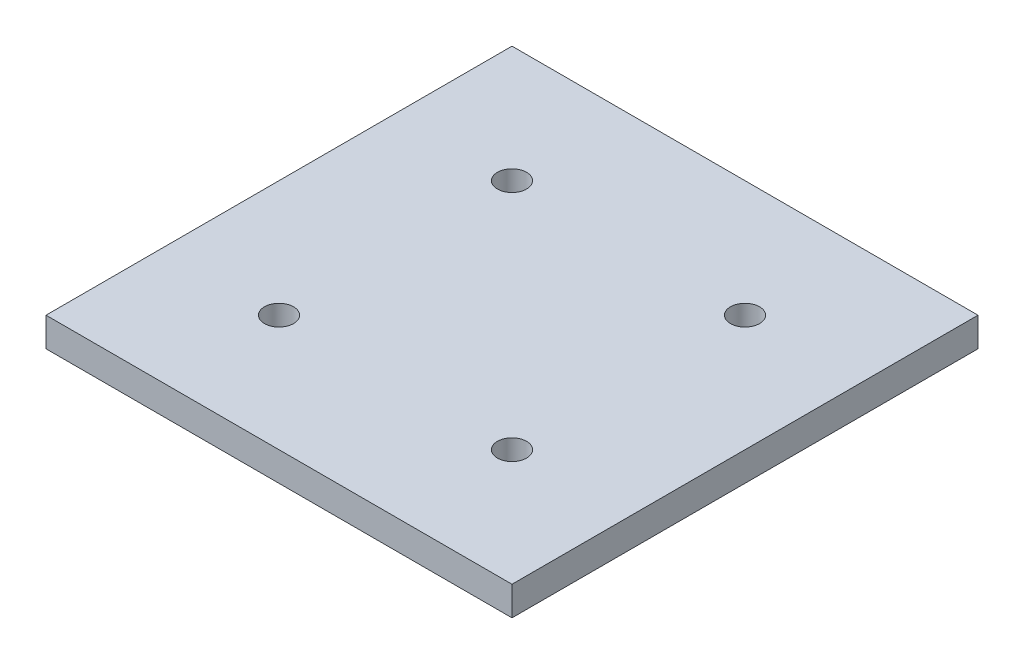
ISO-10303-21;
HEADER;
FILE_DESCRIPTION(('STEP AP214'),'2;1');
FILE_NAME('part.step','',(''),(''),'','','');
FILE_SCHEMA(('AUTOMOTIVE_DESIGN { 1 0 10303 214 1 1 1 1 }'));
ENDSEC;
DATA;
#1=APPLICATION_CONTEXT('core data for automotive mechanical design processes');
#2=APPLICATION_PROTOCOL_DEFINITION('international standard','automotive_design',2000,#1);
#3=PRODUCT_CONTEXT('',#1,'mechanical');
#4=PRODUCT('Part','Part','',(#3));
#5=PRODUCT_RELATED_PRODUCT_CATEGORY('part','',(#4));
#6=PRODUCT_DEFINITION_FORMATION('','',#4);
#7=PRODUCT_DEFINITION_CONTEXT('part definition',#1,'design');
#8=PRODUCT_DEFINITION('design','',#6,#7);
#9=PRODUCT_DEFINITION_SHAPE('','',#8);
#10=(LENGTH_UNIT() NAMED_UNIT(*) SI_UNIT(.MILLI.,.METRE.));
#11=(NAMED_UNIT(*) PLANE_ANGLE_UNIT() SI_UNIT($,.RADIAN.));
#12=(NAMED_UNIT(*) SI_UNIT($,.STERADIAN.) SOLID_ANGLE_UNIT());
#13=UNCERTAINTY_MEASURE_WITH_UNIT(LENGTH_MEASURE(1.E-05),#10,'distance_accuracy_value','');
#14=(GEOMETRIC_REPRESENTATION_CONTEXT(3) GLOBAL_UNCERTAINTY_ASSIGNED_CONTEXT((#13)) GLOBAL_UNIT_ASSIGNED_CONTEXT((#10,
#11,#12)) REPRESENTATION_CONTEXT('',''));
#15=CARTESIAN_POINT('',(0.,0.,0.));
#16=DIRECTION('',(0.,0.,1.));
#17=DIRECTION('',(1.,0.,0.));
#18=AXIS2_PLACEMENT_3D('',#15,#16,#17);
#19=CARTESIAN_POINT('',(0.,6.35,0.));
#20=DIRECTION('',(0.,1.,0.));
#21=DIRECTION('',(0.,0.,1.));
#22=AXIS2_PLACEMENT_3D('',#19,#20,#21);
#23=PLANE('',#22);
#24=CARTESIAN_POINT('',(25.4,6.35,25.4));
#25=DIRECTION('',(0.,1.,0.));
#26=DIRECTION('',(0.,0.,1.));
#27=AXIS2_PLACEMENT_3D('',#24,#25,#26);
#28=CIRCLE('',#27,3.175);
#29=CARTESIAN_POINT('',(25.4,6.35,28.575));
#30=VERTEX_POINT('',#29);
#31=EDGE_CURVE('E121',#30,#30,#28,.T.);
#32=ORIENTED_EDGE('',*,*,#31,.F.);
#33=EDGE_LOOP('',(#32));
#34=FACE_BOUND('',#33,.T.);
#35=CARTESIAN_POINT('',(-25.4,6.35,-25.4));
#36=DIRECTION('',(0.,1.,0.));
#37=DIRECTION('',(0.,0.,1.));
#38=AXIS2_PLACEMENT_3D('',#35,#36,#37);
#39=CIRCLE('',#38,3.175);
#40=CARTESIAN_POINT('',(-25.4,6.35,-22.225));
#41=VERTEX_POINT('',#40);
#42=EDGE_CURVE('E100',#41,#41,#39,.T.);
#43=ORIENTED_EDGE('',*,*,#42,.F.);
#44=EDGE_LOOP('',(#43));
#45=FACE_BOUND('',#44,.T.);
#46=DIRECTION('',(0.,0.,1.));
#47=VECTOR('',#46,1.);
#48=CARTESIAN_POINT('',(-50.8,6.35,-50.8));
#49=LINE('',#48,#47);
#50=CARTESIAN_POINT('',(-50.8,6.35,-50.8));
#51=VERTEX_POINT('',#50);
#52=CARTESIAN_POINT('',(-50.8,6.35,50.8));
#53=VERTEX_POINT('',#52);
#54=EDGE_CURVE('E85',#51,#53,#49,.T.);
#55=ORIENTED_EDGE('',*,*,#54,.T.);
#56=DIRECTION('',(1.,0.,0.));
#57=VECTOR('',#56,1.);
#58=CARTESIAN_POINT('',(-50.8,6.35,50.8));
#59=LINE('',#58,#57);
#60=CARTESIAN_POINT('',(50.8,6.35,50.8));
#61=VERTEX_POINT('',#60);
#62=EDGE_CURVE('E80',#53,#61,#59,.T.);
#63=ORIENTED_EDGE('',*,*,#62,.T.);
#64=DIRECTION('',(0.,0.,-1.));
#65=VECTOR('',#64,1.);
#66=CARTESIAN_POINT('',(50.8,6.35,-50.8));
#67=LINE('',#66,#65);
#68=CARTESIAN_POINT('',(50.8,6.35,-50.8));
#69=VERTEX_POINT('',#68);
#70=EDGE_CURVE('E83',#61,#69,#67,.T.);
#71=ORIENTED_EDGE('',*,*,#70,.T.);
#72=DIRECTION('',(-1.,0.,0.));
#73=VECTOR('',#72,1.);
#74=CARTESIAN_POINT('',(-50.8,6.35,-50.8));
#75=LINE('',#74,#73);
#76=EDGE_CURVE('E50',#69,#51,#75,.T.);
#77=ORIENTED_EDGE('',*,*,#76,.T.);
#78=EDGE_LOOP('',(#55,#63,#71,#77));
#79=FACE_BOUND('',#78,.T.);
#80=CARTESIAN_POINT('',(25.4,6.35,-25.4));
#81=DIRECTION('',(0.,1.,0.));
#82=DIRECTION('',(0.,0.,-1.));
#83=AXIS2_PLACEMENT_3D('',#80,#81,#82);
#84=CIRCLE('',#83,3.175);
#85=CARTESIAN_POINT('',(25.4,6.35,-28.575));
#86=VERTEX_POINT('',#85);
#87=EDGE_CURVE('E115',#86,#86,#84,.T.);
#88=ORIENTED_EDGE('',*,*,#87,.F.);
#89=EDGE_LOOP('',(#88));
#90=FACE_BOUND('',#89,.T.);
#91=CARTESIAN_POINT('',(-25.4,6.35,25.4));
#92=DIRECTION('',(0.,1.,0.));
#93=DIRECTION('',(0.,0.,-1.));
#94=AXIS2_PLACEMENT_3D('',#91,#92,#93);
#95=CIRCLE('',#94,3.175);
#96=CARTESIAN_POINT('',(-25.4,6.35,22.225));
#97=VERTEX_POINT('',#96);
#98=EDGE_CURVE('E127',#97,#97,#95,.T.);
#99=ORIENTED_EDGE('',*,*,#98,.F.);
#100=EDGE_LOOP('',(#99));
#101=FACE_BOUND('',#100,.T.);
#102=ADVANCED_FACE('F33',(#34,#45,#79,#90,#101),#23,.T.);
#103=CARTESIAN_POINT('',(0.,0.,0.));
#104=DIRECTION('',(0.,1.,0.));
#105=DIRECTION('',(0.,0.,1.));
#106=AXIS2_PLACEMENT_3D('',#103,#104,#105);
#107=PLANE('',#106);
#108=DIRECTION('',(0.,0.,1.));
#109=VECTOR('',#108,1.);
#110=CARTESIAN_POINT('',(-50.8,0.,-50.8));
#111=LINE('',#110,#109);
#112=CARTESIAN_POINT('',(-50.8,0.,-50.8));
#113=VERTEX_POINT('',#112);
#114=CARTESIAN_POINT('',(-50.8,0.,50.8));
#115=VERTEX_POINT('',#114);
#116=EDGE_CURVE('E97',#113,#115,#111,.T.);
#117=ORIENTED_EDGE('',*,*,#116,.F.);
#118=DIRECTION('',(-1.,0.,0.));
#119=VECTOR('',#118,1.);
#120=CARTESIAN_POINT('',(-50.8,0.,-50.8));
#121=LINE('',#120,#119);
#122=CARTESIAN_POINT('',(50.8,0.,-50.8));
#123=VERTEX_POINT('',#122);
#124=EDGE_CURVE('E73',#123,#113,#121,.T.);
#125=ORIENTED_EDGE('',*,*,#124,.F.);
#126=DIRECTION('',(0.,0.,-1.));
#127=VECTOR('',#126,1.);
#128=CARTESIAN_POINT('',(50.8,0.,-50.8));
#129=LINE('',#128,#127);
#130=CARTESIAN_POINT('',(50.8,0.,50.8));
#131=VERTEX_POINT('',#130);
#132=EDGE_CURVE('E67',#131,#123,#129,.T.);
#133=ORIENTED_EDGE('',*,*,#132,.F.);
#134=DIRECTION('',(1.,0.,0.));
#135=VECTOR('',#134,1.);
#136=CARTESIAN_POINT('',(-50.8,0.,50.8));
#137=LINE('',#136,#135);
#138=EDGE_CURVE('E89',#115,#131,#137,.T.);
#139=ORIENTED_EDGE('',*,*,#138,.F.);
#140=EDGE_LOOP('',(#117,#125,#133,#139));
#141=FACE_BOUND('',#140,.T.);
#142=CARTESIAN_POINT('',(-25.4,0.,-25.4));
#143=DIRECTION('',(0.,1.,0.));
#144=DIRECTION('',(0.,0.,1.));
#145=AXIS2_PLACEMENT_3D('',#142,#143,#144);
#146=CIRCLE('',#145,3.175);
#147=CARTESIAN_POINT('',(-25.4,0.,-22.225));
#148=VERTEX_POINT('',#147);
#149=EDGE_CURVE('E112',#148,#148,#146,.T.);
#150=ORIENTED_EDGE('',*,*,#149,.T.);
#151=EDGE_LOOP('',(#150));
#152=FACE_BOUND('',#151,.T.);
#153=CARTESIAN_POINT('',(25.4,0.,-25.4));
#154=DIRECTION('',(0.,1.,0.));
#155=DIRECTION('',(0.,0.,-1.));
#156=AXIS2_PLACEMENT_3D('',#153,#154,#155);
#157=CIRCLE('',#156,3.175);
#158=CARTESIAN_POINT('',(25.4,0.,-28.575));
#159=VERTEX_POINT('',#158);
#160=EDGE_CURVE('E118',#159,#159,#157,.T.);
#161=ORIENTED_EDGE('',*,*,#160,.T.);
#162=EDGE_LOOP('',(#161));
#163=FACE_BOUND('',#162,.T.);
#164=CARTESIAN_POINT('',(25.4,0.,25.4));
#165=DIRECTION('',(0.,1.,0.));
#166=DIRECTION('',(0.,0.,1.));
#167=AXIS2_PLACEMENT_3D('',#164,#165,#166);
#168=CIRCLE('',#167,3.175);
#169=CARTESIAN_POINT('',(25.4,0.,28.575));
#170=VERTEX_POINT('',#169);
#171=EDGE_CURVE('E124',#170,#170,#168,.T.);
#172=ORIENTED_EDGE('',*,*,#171,.T.);
#173=EDGE_LOOP('',(#172));
#174=FACE_BOUND('',#173,.T.);
#175=CARTESIAN_POINT('',(-25.4,0.,25.4));
#176=DIRECTION('',(0.,1.,0.));
#177=DIRECTION('',(0.,0.,-1.));
#178=AXIS2_PLACEMENT_3D('',#175,#176,#177);
#179=CIRCLE('',#178,3.175);
#180=CARTESIAN_POINT('',(-25.4,0.,22.225));
#181=VERTEX_POINT('',#180);
#182=EDGE_CURVE('E130',#181,#181,#179,.T.);
#183=ORIENTED_EDGE('',*,*,#182,.T.);
#184=EDGE_LOOP('',(#183));
#185=FACE_BOUND('',#184,.T.);
#186=ADVANCED_FACE('F108',(#141,#152,#163,#174,#185),#107,.F.);
#187=CARTESIAN_POINT('',(-50.8,6.35,-50.8));
#188=DIRECTION('',(1.,0.,0.));
#189=DIRECTION('',(0.,0.,-1.));
#190=AXIS2_PLACEMENT_3D('',#187,#188,#189);
#191=PLANE('',#190);
#192=ORIENTED_EDGE('',*,*,#116,.T.);
#193=DIRECTION('',(0.,-1.,0.));
#194=VECTOR('',#193,1.);
#195=CARTESIAN_POINT('',(-50.8,6.35,50.8));
#196=LINE('',#195,#194);
#197=EDGE_CURVE('E11',#53,#115,#196,.T.);
#198=ORIENTED_EDGE('',*,*,#197,.F.);
#199=ORIENTED_EDGE('',*,*,#54,.F.);
#200=DIRECTION('',(0.,-1.,0.));
#201=VECTOR('',#200,1.);
#202=CARTESIAN_POINT('',(-50.8,6.35,-50.8));
#203=LINE('',#202,#201);
#204=EDGE_CURVE('E93',#51,#113,#203,.T.);
#205=ORIENTED_EDGE('',*,*,#204,.T.);
#206=EDGE_LOOP('',(#192,#198,#199,#205));
#207=FACE_BOUND('',#206,.T.);
#208=ADVANCED_FACE('F35',(#207),#191,.F.);
#209=CARTESIAN_POINT('',(-50.8,6.35,50.8));
#210=DIRECTION('',(0.,0.,-1.));
#211=DIRECTION('',(-1.,0.,0.));
#212=AXIS2_PLACEMENT_3D('',#209,#210,#211);
#213=PLANE('',#212);
#214=ORIENTED_EDGE('',*,*,#138,.T.);
#215=DIRECTION('',(0.,-1.,0.));
#216=VECTOR('',#215,1.);
#217=CARTESIAN_POINT('',(50.8,6.35,50.8));
#218=LINE('',#217,#216);
#219=EDGE_CURVE('E42',#61,#131,#218,.T.);
#220=ORIENTED_EDGE('',*,*,#219,.F.);
#221=ORIENTED_EDGE('',*,*,#62,.F.);
#222=ORIENTED_EDGE('',*,*,#197,.T.);
#223=EDGE_LOOP('',(#214,#220,#221,#222));
#224=FACE_BOUND('',#223,.T.);
#225=ADVANCED_FACE('F88',(#224),#213,.F.);
#226=CARTESIAN_POINT('',(50.8,6.35,-50.8));
#227=DIRECTION('',(-1.,0.,0.));
#228=DIRECTION('',(0.,0.,1.));
#229=AXIS2_PLACEMENT_3D('',#226,#227,#228);
#230=PLANE('',#229);
#231=ORIENTED_EDGE('',*,*,#132,.T.);
#232=DIRECTION('',(0.,-1.,0.));
#233=VECTOR('',#232,1.);
#234=CARTESIAN_POINT('',(50.8,6.35,-50.8));
#235=LINE('',#234,#233);
#236=EDGE_CURVE('E90',#69,#123,#235,.T.);
#237=ORIENTED_EDGE('',*,*,#236,.F.);
#238=ORIENTED_EDGE('',*,*,#70,.F.);
#239=ORIENTED_EDGE('',*,*,#219,.T.);
#240=EDGE_LOOP('',(#231,#237,#238,#239));
#241=FACE_BOUND('',#240,.T.);
#242=ADVANCED_FACE('F91',(#241),#230,.F.);
#243=CARTESIAN_POINT('',(-50.8,6.35,-50.8));
#244=DIRECTION('',(0.,0.,1.));
#245=DIRECTION('',(1.,0.,0.));
#246=AXIS2_PLACEMENT_3D('',#243,#244,#245);
#247=PLANE('',#246);
#248=ORIENTED_EDGE('',*,*,#124,.T.);
#249=ORIENTED_EDGE('',*,*,#204,.F.);
#250=ORIENTED_EDGE('',*,*,#76,.F.);
#251=ORIENTED_EDGE('',*,*,#236,.T.);
#252=EDGE_LOOP('',(#248,#249,#250,#251));
#253=FACE_BOUND('',#252,.T.);
#254=ADVANCED_FACE('F105',(#253),#247,.F.);
#255=CARTESIAN_POINT('',(-25.4,6.35,-25.4));
#256=DIRECTION('',(0.,-1.,0.));
#257=DIRECTION('',(0.,0.,-1.));
#258=AXIS2_PLACEMENT_3D('',#255,#256,#257);
#259=CYLINDRICAL_SURFACE('',#258,3.175);
#260=ORIENTED_EDGE('',*,*,#42,.T.);
#261=EDGE_LOOP('',(#260));
#262=FACE_BOUND('',#261,.T.);
#263=ORIENTED_EDGE('',*,*,#149,.F.);
#264=EDGE_LOOP('',(#263));
#265=FACE_BOUND('',#264,.T.);
#266=ADVANCED_FACE('F149',(#262,#265),#259,.F.);
#267=CARTESIAN_POINT('',(25.4,6.35,-25.4));
#268=DIRECTION('',(0.,-1.,0.));
#269=DIRECTION('',(0.,0.,-1.));
#270=AXIS2_PLACEMENT_3D('',#267,#268,#269);
#271=CYLINDRICAL_SURFACE('',#270,3.175);
#272=ORIENTED_EDGE('',*,*,#87,.T.);
#273=EDGE_LOOP('',(#272));
#274=FACE_BOUND('',#273,.T.);
#275=ORIENTED_EDGE('',*,*,#160,.F.);
#276=EDGE_LOOP('',(#275));
#277=FACE_BOUND('',#276,.T.);
#278=ADVANCED_FACE('F195',(#274,#277),#271,.F.);
#279=CARTESIAN_POINT('',(25.4,6.35,25.4));
#280=DIRECTION('',(0.,-1.,0.));
#281=DIRECTION('',(0.,0.,-1.));
#282=AXIS2_PLACEMENT_3D('',#279,#280,#281);
#283=CYLINDRICAL_SURFACE('',#282,3.175);
#284=ORIENTED_EDGE('',*,*,#31,.T.);
#285=EDGE_LOOP('',(#284));
#286=FACE_BOUND('',#285,.T.);
#287=ORIENTED_EDGE('',*,*,#171,.F.);
#288=EDGE_LOOP('',(#287));
#289=FACE_BOUND('',#288,.T.);
#290=ADVANCED_FACE('F203',(#286,#289),#283,.F.);
#291=CARTESIAN_POINT('',(-25.4,6.35,25.4));
#292=DIRECTION('',(0.,-1.,0.));
#293=DIRECTION('',(0.,0.,-1.));
#294=AXIS2_PLACEMENT_3D('',#291,#292,#293);
#295=CYLINDRICAL_SURFACE('',#294,3.175);
#296=ORIENTED_EDGE('',*,*,#98,.T.);
#297=EDGE_LOOP('',(#296));
#298=FACE_BOUND('',#297,.T.);
#299=ORIENTED_EDGE('',*,*,#182,.F.);
#300=EDGE_LOOP('',(#299));
#301=FACE_BOUND('',#300,.T.);
#302=ADVANCED_FACE('F136',(#298,#301),#295,.F.);
#303=CLOSED_SHELL('',(#102,#186,#208,#225,#242,#254,#266,#278,#290,#302));
#304=MANIFOLD_SOLID_BREP('B2',#303);
#305=ADVANCED_BREP_SHAPE_REPRESENTATION('',(#18,#304),#14);
#306=SHAPE_DEFINITION_REPRESENTATION(#9,#305);
ENDSEC;
END-ISO-10303-21;
